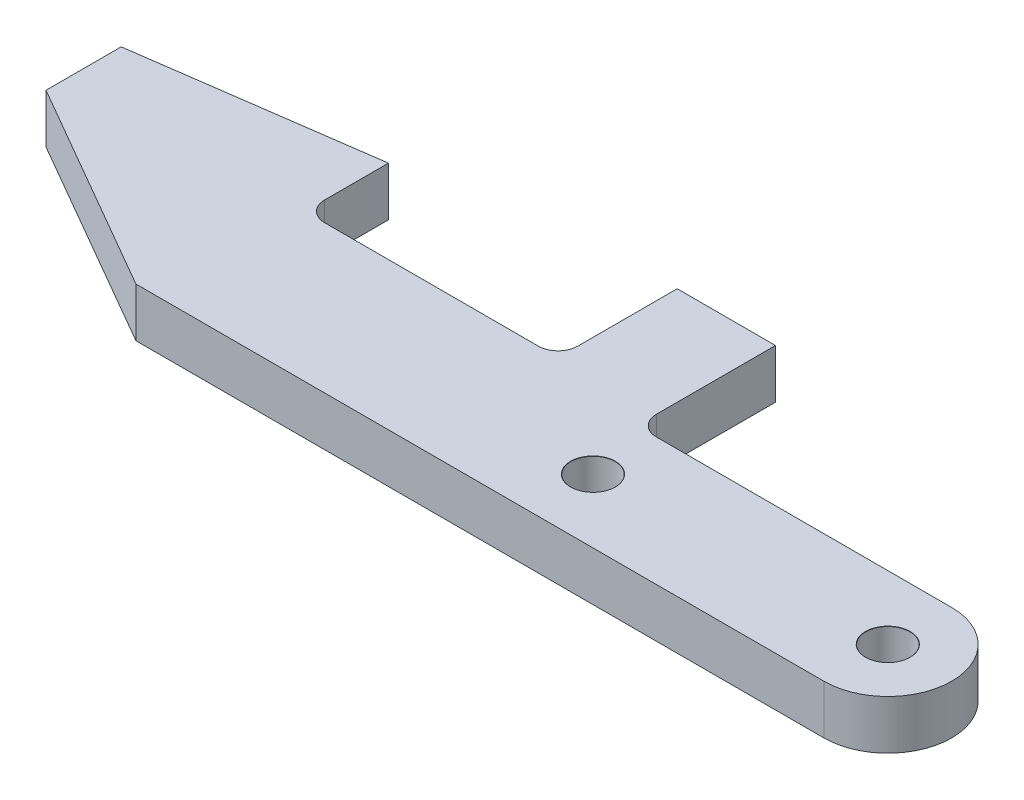
ISO-10303-21;
HEADER;
FILE_DESCRIPTION(('STEP AP214'),'2;1');
FILE_NAME('part.step','',(''),(''),'','','');
FILE_SCHEMA(('AUTOMOTIVE_DESIGN { 1 0 10303 214 1 1 1 1 }'));
ENDSEC;
DATA;
#1=APPLICATION_CONTEXT('core data for automotive mechanical design processes');
#2=APPLICATION_PROTOCOL_DEFINITION('international standard','automotive_design',2000,#1);
#3=PRODUCT_CONTEXT('',#1,'mechanical');
#4=PRODUCT('Part','Part','',(#3));
#5=PRODUCT_RELATED_PRODUCT_CATEGORY('part','',(#4));
#6=PRODUCT_DEFINITION_FORMATION('','',#4);
#7=PRODUCT_DEFINITION_CONTEXT('part definition',#1,'design');
#8=PRODUCT_DEFINITION('design','',#6,#7);
#9=PRODUCT_DEFINITION_SHAPE('','',#8);
#10=(LENGTH_UNIT() NAMED_UNIT(*) SI_UNIT(.MILLI.,.METRE.));
#11=(NAMED_UNIT(*) PLANE_ANGLE_UNIT() SI_UNIT($,.RADIAN.));
#12=(NAMED_UNIT(*) SI_UNIT($,.STERADIAN.) SOLID_ANGLE_UNIT());
#13=UNCERTAINTY_MEASURE_WITH_UNIT(LENGTH_MEASURE(1.E-05),#10,'distance_accuracy_value','');
#14=(GEOMETRIC_REPRESENTATION_CONTEXT(3) GLOBAL_UNCERTAINTY_ASSIGNED_CONTEXT((#13)) GLOBAL_UNIT_ASSIGNED_CONTEXT((#10,
#11,#12)) REPRESENTATION_CONTEXT('',''));
#15=CARTESIAN_POINT('',(0.,0.,0.));
#16=DIRECTION('',(0.,0.,1.));
#17=DIRECTION('',(1.,0.,0.));
#18=AXIS2_PLACEMENT_3D('',#15,#16,#17);
#19=CARTESIAN_POINT('',(-56.6506350946111,5.,-20.1491745987615));
#20=DIRECTION('',(0.139173100960062,0.,0.990268068741571));
#21=DIRECTION('',(0.990268068741571,0.,-0.139173100960062));
#22=AXIS2_PLACEMENT_3D('',#19,#20,#21);
#23=PLANE('',#22);
#24=DIRECTION('',(-0.990268068741571,0.,0.139173100960062));
#25=VECTOR('',#24,1.);
#26=CARTESIAN_POINT('',(-56.6506350946111,5.,-20.1491745987615));
#27=LINE('',#26,#25);
#28=CARTESIAN_POINT('',(-32.8082734896425,5.,-23.5));
#29=VERTEX_POINT('',#28);
#30=CARTESIAN_POINT('',(-56.6506350946111,5.,-20.1491745987615));
#31=VERTEX_POINT('',#30);
#32=EDGE_CURVE('E176',#29,#31,#27,.T.);
#33=ORIENTED_EDGE('',*,*,#32,.F.);
#34=DIRECTION('',(0.,1.,0.));
#35=VECTOR('',#34,1.);
#36=CARTESIAN_POINT('',(-32.8082734896425,0.,-23.5));
#37=LINE('',#36,#35);
#38=CARTESIAN_POINT('',(-32.8082734896425,0.,-23.5));
#39=VERTEX_POINT('',#38);
#40=EDGE_CURVE('E338',#39,#29,#37,.T.);
#41=ORIENTED_EDGE('',*,*,#40,.F.);
#42=DIRECTION('',(-0.990268068741571,0.,0.139173100960062));
#43=VECTOR('',#42,1.);
#44=CARTESIAN_POINT('',(-56.6506350946111,0.,-20.1491745987615));
#45=LINE('',#44,#43);
#46=CARTESIAN_POINT('',(-56.6506350946111,0.,-20.1491745987615));
#47=VERTEX_POINT('',#46);
#48=EDGE_CURVE('E291',#39,#47,#45,.T.);
#49=ORIENTED_EDGE('',*,*,#48,.T.);
#50=DIRECTION('',(0.,-1.,0.));
#51=VECTOR('',#50,1.);
#52=CARTESIAN_POINT('',(-56.6506350946111,5.,-20.1491745987615));
#53=LINE('',#52,#51);
#54=EDGE_CURVE('E206',#31,#47,#53,.T.);
#55=ORIENTED_EDGE('',*,*,#54,.F.);
#56=EDGE_LOOP('',(#33,#41,#49,#55));
#57=FACE_BOUND('',#56,.T.);
#58=ADVANCED_FACE('F43',(#57),#23,.F.);
#59=CARTESIAN_POINT('',(-56.6506350946111,5.,-12.4999999999999));
#60=DIRECTION('',(1.,0.,0.));
#61=DIRECTION('',(0.,0.,-1.));
#62=AXIS2_PLACEMENT_3D('',#59,#60,#61);
#63=PLANE('',#62);
#64=DIRECTION('',(0.,0.,1.));
#65=VECTOR('',#64,1.);
#66=CARTESIAN_POINT('',(-56.6506350946111,0.,-12.4999999999999));
#67=LINE('',#66,#65);
#68=CARTESIAN_POINT('',(-56.6506350946111,0.,-12.4999999999999));
#69=VERTEX_POINT('',#68);
#70=EDGE_CURVE('E294',#47,#69,#67,.T.);
#71=ORIENTED_EDGE('',*,*,#70,.T.);
#72=DIRECTION('',(0.,-1.,0.));
#73=VECTOR('',#72,1.);
#74=CARTESIAN_POINT('',(-56.6506350946111,5.,-12.4999999999999));
#75=LINE('',#74,#73);
#76=CARTESIAN_POINT('',(-56.6506350946111,5.,-12.4999999999999));
#77=VERTEX_POINT('',#76);
#78=EDGE_CURVE('E202',#77,#69,#75,.T.);
#79=ORIENTED_EDGE('',*,*,#78,.F.);
#80=DIRECTION('',(0.,0.,1.));
#81=VECTOR('',#80,1.);
#82=CARTESIAN_POINT('',(-56.6506350946111,5.,-12.4999999999999));
#83=LINE('',#82,#81);
#84=EDGE_CURVE('E182',#31,#77,#83,.T.);
#85=ORIENTED_EDGE('',*,*,#84,.F.);
#86=ORIENTED_EDGE('',*,*,#54,.T.);
#87=EDGE_LOOP('',(#71,#79,#85,#86));
#88=FACE_BOUND('',#87,.T.);
#89=ADVANCED_FACE('F390',(#88),#63,.F.);
#90=CARTESIAN_POINT('',(-35.,5.,0.));
#91=DIRECTION('',(0.499999999999994,0.,-0.866025403784442));
#92=DIRECTION('',(-0.866025403784442,0.,-0.499999999999994));
#93=AXIS2_PLACEMENT_3D('',#90,#91,#92);
#94=PLANE('',#93);
#95=DIRECTION('',(0.866025403784442,0.,0.499999999999994));
#96=VECTOR('',#95,1.);
#97=CARTESIAN_POINT('',(-35.,0.,0.));
#98=LINE('',#97,#96);
#99=CARTESIAN_POINT('',(-35.,0.,0.));
#100=VERTEX_POINT('',#99);
#101=EDGE_CURVE('E298',#69,#100,#98,.T.);
#102=ORIENTED_EDGE('',*,*,#101,.T.);
#103=DIRECTION('',(0.,-1.,0.));
#104=VECTOR('',#103,1.);
#105=CARTESIAN_POINT('',(-35.,5.,0.));
#106=LINE('',#105,#104);
#107=CARTESIAN_POINT('',(-35.,5.,0.));
#108=VERTEX_POINT('',#107);
#109=EDGE_CURVE('E198',#108,#100,#106,.T.);
#110=ORIENTED_EDGE('',*,*,#109,.F.);
#111=DIRECTION('',(0.866025403784442,0.,0.499999999999994));
#112=VECTOR('',#111,1.);
#113=CARTESIAN_POINT('',(-35.,5.,0.));
#114=LINE('',#113,#112);
#115=EDGE_CURVE('E279',#77,#108,#114,.T.);
#116=ORIENTED_EDGE('',*,*,#115,.F.);
#117=ORIENTED_EDGE('',*,*,#78,.T.);
#118=EDGE_LOOP('',(#102,#110,#116,#117));
#119=FACE_BOUND('',#118,.T.);
#120=ADVANCED_FACE('F397',(#119),#94,.F.);
#121=CARTESIAN_POINT('',(-35.,5.,0.));
#122=DIRECTION('',(0.,0.,-1.));
#123=DIRECTION('',(-1.,0.,0.));
#124=AXIS2_PLACEMENT_3D('',#121,#122,#123);
#125=PLANE('',#124);
#126=DIRECTION('',(1.,0.,0.));
#127=VECTOR('',#126,1.);
#128=CARTESIAN_POINT('',(-35.,0.,0.));
#129=LINE('',#128,#127);
#130=CARTESIAN_POINT('',(35.,0.,0.));
#131=VERTEX_POINT('',#130);
#132=EDGE_CURVE('E301',#100,#131,#129,.T.);
#133=ORIENTED_EDGE('',*,*,#132,.T.);
#134=DIRECTION('',(0.,-1.,0.));
#135=VECTOR('',#134,1.);
#136=CARTESIAN_POINT('',(35.,5.,0.));
#137=LINE('',#136,#135);
#138=CARTESIAN_POINT('',(35.,5.,0.));
#139=VERTEX_POINT('',#138);
#140=EDGE_CURVE('E194',#139,#131,#137,.T.);
#141=ORIENTED_EDGE('',*,*,#140,.F.);
#142=DIRECTION('',(1.,0.,0.));
#143=VECTOR('',#142,1.);
#144=CARTESIAN_POINT('',(-35.,5.,0.));
#145=LINE('',#144,#143);
#146=EDGE_CURVE('E275',#108,#139,#145,.T.);
#147=ORIENTED_EDGE('',*,*,#146,.F.);
#148=ORIENTED_EDGE('',*,*,#109,.T.);
#149=EDGE_LOOP('',(#133,#141,#147,#148));
#150=FACE_BOUND('',#149,.T.);
#151=ADVANCED_FACE('F434',(#150),#125,.F.);
#152=CARTESIAN_POINT('',(35.,5.,-6.49999999999995));
#153=DIRECTION('',(0.,-1.,0.));
#154=DIRECTION('',(0.,0.,-1.));
#155=AXIS2_PLACEMENT_3D('',#152,#153,#154);
#156=CYLINDRICAL_SURFACE('',#155,6.49999999999995);
#157=CARTESIAN_POINT('',(35.,0.,-6.49999999999995));
#158=DIRECTION('',(0.,1.,0.));
#159=DIRECTION('',(0.,0.,1.));
#160=AXIS2_PLACEMENT_3D('',#157,#158,#159);
#161=CIRCLE('',#160,6.49999999999995);
#162=CARTESIAN_POINT('',(35.,0.,-12.9999999999999));
#163=VERTEX_POINT('',#162);
#164=EDGE_CURVE('E304',#131,#163,#161,.T.);
#165=ORIENTED_EDGE('',*,*,#164,.T.);
#166=DIRECTION('',(0.,-1.,0.));
#167=VECTOR('',#166,1.);
#168=CARTESIAN_POINT('',(35.,5.,-12.9999999999999));
#169=LINE('',#168,#167);
#170=CARTESIAN_POINT('',(35.,5.,-12.9999999999999));
#171=VERTEX_POINT('',#170);
#172=EDGE_CURVE('E190',#171,#163,#169,.T.);
#173=ORIENTED_EDGE('',*,*,#172,.F.);
#174=CARTESIAN_POINT('',(35.,5.,-6.49999999999995));
#175=DIRECTION('',(0.,1.,0.));
#176=DIRECTION('',(0.,0.,1.));
#177=AXIS2_PLACEMENT_3D('',#174,#175,#176);
#178=CIRCLE('',#177,6.49999999999995);
#179=EDGE_CURVE('E271',#139,#171,#178,.T.);
#180=ORIENTED_EDGE('',*,*,#179,.F.);
#181=ORIENTED_EDGE('',*,*,#140,.T.);
#182=EDGE_LOOP('',(#165,#173,#180,#181));
#183=FACE_BOUND('',#182,.T.);
#184=ADVANCED_FACE('F437',(#183),#156,.T.);
#185=CARTESIAN_POINT('',(35.,5.,-12.9999999999999));
#186=DIRECTION('',(0.,0.,1.));
#187=DIRECTION('',(1.,0.,0.));
#188=AXIS2_PLACEMENT_3D('',#185,#186,#187);
#189=PLANE('',#188);
#190=DIRECTION('',(-1.,0.,0.));
#191=VECTOR('',#190,1.);
#192=CARTESIAN_POINT('',(35.,0.,-12.9999999999999));
#193=LINE('',#192,#191);
#194=CARTESIAN_POINT('',(4.94936490538895,0.,-13.));
#195=VERTEX_POINT('',#194);
#196=EDGE_CURVE('E184',#163,#195,#193,.T.);
#197=ORIENTED_EDGE('',*,*,#196,.T.);
#198=DIRECTION('',(0.,-1.,0.));
#199=VECTOR('',#198,1.);
#200=CARTESIAN_POINT('',(4.94936490538895,5.,-13.));
#201=LINE('',#200,#199);
#202=CARTESIAN_POINT('',(4.94936490538895,5.,-13.));
#203=VERTEX_POINT('',#202);
#204=EDGE_CURVE('E214',#195,#203,#201,.F.);
#205=ORIENTED_EDGE('',*,*,#204,.T.);
#206=DIRECTION('',(-1.,0.,0.));
#207=VECTOR('',#206,1.);
#208=CARTESIAN_POINT('',(35.,5.,-12.9999999999999));
#209=LINE('',#208,#207);
#210=EDGE_CURVE('E266',#171,#203,#209,.T.);
#211=ORIENTED_EDGE('',*,*,#210,.F.);
#212=ORIENTED_EDGE('',*,*,#172,.T.);
#213=EDGE_LOOP('',(#197,#205,#211,#212));
#214=FACE_BOUND('',#213,.T.);
#215=ADVANCED_FACE('F312',(#214),#189,.F.);
#216=CARTESIAN_POINT('',(2.94936490538897,5.,-27.12));
#217=DIRECTION('',(-1.,0.,0.));
#218=DIRECTION('',(0.,0.,1.));
#219=AXIS2_PLACEMENT_3D('',#216,#217,#218);
#220=PLANE('',#219);
#221=DIRECTION('',(0.,0.,-1.));
#222=VECTOR('',#221,1.);
#223=CARTESIAN_POINT('',(2.94936490538897,5.,-27.12));
#224=LINE('',#223,#222);
#225=CARTESIAN_POINT('',(2.94936490538895,5.,-15.));
#226=VERTEX_POINT('',#225);
#227=CARTESIAN_POINT('',(2.94936490538897,5.,-27.12));
#228=VERTEX_POINT('',#227);
#229=EDGE_CURVE('E262',#226,#228,#224,.T.);
#230=ORIENTED_EDGE('',*,*,#229,.F.);
#231=DIRECTION('',(0.,-1.,0.));
#232=VECTOR('',#231,1.);
#233=CARTESIAN_POINT('',(2.94936490538895,0.,-15.));
#234=LINE('',#233,#232);
#235=CARTESIAN_POINT('',(2.94936490538895,0.,-15.));
#236=VERTEX_POINT('',#235);
#237=EDGE_CURVE('E210',#226,#236,#234,.T.);
#238=ORIENTED_EDGE('',*,*,#237,.T.);
#239=DIRECTION('',(0.,0.,-1.));
#240=VECTOR('',#239,1.);
#241=CARTESIAN_POINT('',(2.94936490538897,0.,-27.12));
#242=LINE('',#241,#240);
#243=CARTESIAN_POINT('',(2.94936490538897,0.,-27.12));
#244=VERTEX_POINT('',#243);
#245=EDGE_CURVE('E177',#236,#244,#242,.T.);
#246=ORIENTED_EDGE('',*,*,#245,.T.);
#247=DIRECTION('',(0.,-1.,0.));
#248=VECTOR('',#247,1.);
#249=CARTESIAN_POINT('',(2.94936490538897,5.,-27.12));
#250=LINE('',#249,#248);
#251=EDGE_CURVE('E169',#228,#244,#250,.T.);
#252=ORIENTED_EDGE('',*,*,#251,.F.);
#253=EDGE_LOOP('',(#230,#238,#246,#252));
#254=FACE_BOUND('',#253,.T.);
#255=ADVANCED_FACE('F324',(#254),#220,.F.);
#256=CARTESIAN_POINT('',(-7.05063509461103,5.,-27.12));
#257=DIRECTION('',(0.,0.,1.));
#258=DIRECTION('',(1.,0.,0.));
#259=AXIS2_PLACEMENT_3D('',#256,#257,#258);
#260=PLANE('',#259);
#261=DIRECTION('',(-1.,0.,0.));
#262=VECTOR('',#261,1.);
#263=CARTESIAN_POINT('',(-7.05063509461103,0.,-27.12));
#264=LINE('',#263,#262);
#265=CARTESIAN_POINT('',(-7.05063509461103,0.,-27.12));
#266=VERTEX_POINT('',#265);
#267=EDGE_CURVE('E149',#244,#266,#264,.T.);
#268=ORIENTED_EDGE('',*,*,#267,.T.);
#269=DIRECTION('',(0.,-1.,0.));
#270=VECTOR('',#269,1.);
#271=CARTESIAN_POINT('',(-7.05063509461103,5.,-27.12));
#272=LINE('',#271,#270);
#273=CARTESIAN_POINT('',(-7.05063509461103,5.,-27.12));
#274=VERTEX_POINT('',#273);
#275=EDGE_CURVE('E161',#274,#266,#272,.T.);
#276=ORIENTED_EDGE('',*,*,#275,.F.);
#277=DIRECTION('',(-1.,0.,0.));
#278=VECTOR('',#277,1.);
#279=CARTESIAN_POINT('',(-7.05063509461103,5.,-27.12));
#280=LINE('',#279,#278);
#281=EDGE_CURVE('E170',#228,#274,#280,.T.);
#282=ORIENTED_EDGE('',*,*,#281,.F.);
#283=ORIENTED_EDGE('',*,*,#251,.T.);
#284=EDGE_LOOP('',(#268,#276,#282,#283));
#285=FACE_BOUND('',#284,.T.);
#286=ADVANCED_FACE('F173',(#285),#260,.F.);
#287=CARTESIAN_POINT('',(35.,5.,-6.49999999999995));
#288=DIRECTION('',(0.,1.,0.));
#289=DIRECTION('',(0.,0.,1.));
#290=AXIS2_PLACEMENT_3D('',#287,#288,#289);
#291=PLANE('',#290);
#292=DIRECTION('',(0.,0.,-1.));
#293=VECTOR('',#292,1.);
#294=CARTESIAN_POINT('',(-7.05063509461103,5.,-27.12));
#295=LINE('',#294,#293);
#296=CARTESIAN_POINT('',(-7.05063509461103,5.,-17.));
#297=VERTEX_POINT('',#296);
#298=EDGE_CURVE('E164',#297,#274,#295,.T.);
#299=ORIENTED_EDGE('',*,*,#298,.F.);
#300=CARTESIAN_POINT('',(-9.05063509461103,5.,-17.));
#301=DIRECTION('',(0.,1.,0.));
#302=DIRECTION('',(0.,0.,1.));
#303=AXIS2_PLACEMENT_3D('',#300,#301,#302);
#304=CIRCLE('',#303,2.);
#305=CARTESIAN_POINT('',(-9.05063509461103,5.,-15.));
#306=VERTEX_POINT('',#305);
#307=EDGE_CURVE('E235',#297,#306,#304,.F.);
#308=ORIENTED_EDGE('',*,*,#307,.T.);
#309=DIRECTION('',(1.,0.,0.));
#310=VECTOR('',#309,1.);
#311=CARTESIAN_POINT('',(-7.05063509461103,5.,-15.));
#312=LINE('',#311,#310);
#313=CARTESIAN_POINT('',(-30.8082734896425,5.,-15.));
#314=VERTEX_POINT('',#313);
#315=EDGE_CURVE('E158',#314,#306,#312,.T.);
#316=ORIENTED_EDGE('',*,*,#315,.F.);
#317=CARTESIAN_POINT('',(-30.8082734896425,5.,-17.));
#318=DIRECTION('',(0.,1.,0.));
#319=DIRECTION('',(0.,0.,1.));
#320=AXIS2_PLACEMENT_3D('',#317,#318,#319);
#321=CIRCLE('',#320,2.);
#322=CARTESIAN_POINT('',(-32.8082734896425,5.,-17.));
#323=VERTEX_POINT('',#322);
#324=EDGE_CURVE('E52',#314,#323,#321,.F.);
#325=ORIENTED_EDGE('',*,*,#324,.T.);
#326=DIRECTION('',(0.,0.,1.));
#327=VECTOR('',#326,1.);
#328=CARTESIAN_POINT('',(-32.8082734896425,5.,-23.5));
#329=LINE('',#328,#327);
#330=EDGE_CURVE('E327',#29,#323,#329,.T.);
#331=ORIENTED_EDGE('',*,*,#330,.F.);
#332=ORIENTED_EDGE('',*,*,#32,.T.);
#333=ORIENTED_EDGE('',*,*,#84,.T.);
#334=ORIENTED_EDGE('',*,*,#115,.T.);
#335=ORIENTED_EDGE('',*,*,#146,.T.);
#336=ORIENTED_EDGE('',*,*,#179,.T.);
#337=ORIENTED_EDGE('',*,*,#210,.T.);
#338=CARTESIAN_POINT('',(4.94936490538895,5.,-15.));
#339=DIRECTION('',(0.,1.,0.));
#340=DIRECTION('',(0.,0.,1.));
#341=AXIS2_PLACEMENT_3D('',#338,#339,#340);
#342=CIRCLE('',#341,2.);
#343=EDGE_CURVE('E232',#203,#226,#342,.F.);
#344=ORIENTED_EDGE('',*,*,#343,.T.);
#345=ORIENTED_EDGE('',*,*,#229,.T.);
#346=ORIENTED_EDGE('',*,*,#281,.T.);
#347=EDGE_LOOP('',(#299,#308,#316,#325,#331,#332,#333,#334,#335,#336,#337,#344,#345,#346));
#348=FACE_BOUND('',#347,.T.);
#349=CARTESIAN_POINT('',(35.,5.,-6.49999999999995));
#350=DIRECTION('',(0.,1.,0.));
#351=DIRECTION('',(0.,0.,1.));
#352=AXIS2_PLACEMENT_3D('',#349,#350,#351);
#353=CIRCLE('',#352,2.275);
#354=CARTESIAN_POINT('',(35.,5.,-4.22499999999995));
#355=VERTEX_POINT('',#354);
#356=EDGE_CURVE('E341',#355,#355,#353,.T.);
#357=ORIENTED_EDGE('',*,*,#356,.F.);
#358=EDGE_LOOP('',(#357));
#359=FACE_BOUND('',#358,.T.);
#360=CARTESIAN_POINT('',(5.,5.,-6.49999999999995));
#361=DIRECTION('',(0.,1.,0.));
#362=DIRECTION('',(0.,0.,1.));
#363=AXIS2_PLACEMENT_3D('',#360,#361,#362);
#364=CIRCLE('',#363,2.275);
#365=CARTESIAN_POINT('',(5.,5.,-4.22499999999995));
#366=VERTEX_POINT('',#365);
#367=EDGE_CURVE('E353',#366,#366,#364,.T.);
#368=ORIENTED_EDGE('',*,*,#367,.F.);
#369=EDGE_LOOP('',(#368));
#370=FACE_BOUND('',#369,.T.);
#371=ADVANCED_FACE('F321',(#348,#359,#370),#291,.T.);
#372=CARTESIAN_POINT('',(35.,0.,-6.49999999999995));
#373=DIRECTION('',(0.,1.,0.));
#374=DIRECTION('',(0.,0.,1.));
#375=AXIS2_PLACEMENT_3D('',#372,#373,#374);
#376=PLANE('',#375);
#377=CARTESIAN_POINT('',(35.,0.,-6.49999999999995));
#378=DIRECTION('',(0.,1.,0.));
#379=DIRECTION('',(0.,0.,1.));
#380=AXIS2_PLACEMENT_3D('',#377,#378,#379);
#381=CIRCLE('',#380,2.25);
#382=CARTESIAN_POINT('',(35.,0.,-4.24999999999995));
#383=VERTEX_POINT('',#382);
#384=EDGE_CURVE('E349',#383,#383,#381,.T.);
#385=ORIENTED_EDGE('',*,*,#384,.T.);
#386=EDGE_LOOP('',(#385));
#387=FACE_BOUND('',#386,.T.);
#388=CARTESIAN_POINT('',(5.,0.,-6.49999999999995));
#389=DIRECTION('',(0.,1.,0.));
#390=DIRECTION('',(0.,0.,1.));
#391=AXIS2_PLACEMENT_3D('',#388,#389,#390);
#392=CIRCLE('',#391,2.25);
#393=CARTESIAN_POINT('',(5.,0.,-4.24999999999995));
#394=VERTEX_POINT('',#393);
#395=EDGE_CURVE('E295',#394,#394,#392,.T.);
#396=ORIENTED_EDGE('',*,*,#395,.T.);
#397=EDGE_LOOP('',(#396));
#398=FACE_BOUND('',#397,.T.);
#399=DIRECTION('',(0.,0.,1.));
#400=VECTOR('',#399,1.);
#401=CARTESIAN_POINT('',(-32.8082734896425,0.,-23.5));
#402=LINE('',#401,#400);
#403=CARTESIAN_POINT('',(-32.8082734896425,0.,-17.));
#404=VERTEX_POINT('',#403);
#405=EDGE_CURVE('E157',#39,#404,#402,.T.);
#406=ORIENTED_EDGE('',*,*,#405,.T.);
#407=CARTESIAN_POINT('',(-30.8082734896425,0.,-17.));
#408=DIRECTION('',(0.,1.,0.));
#409=DIRECTION('',(0.,0.,1.));
#410=AXIS2_PLACEMENT_3D('',#407,#408,#409);
#411=CIRCLE('',#410,2.);
#412=CARTESIAN_POINT('',(-30.8082734896425,0.,-15.));
#413=VERTEX_POINT('',#412);
#414=EDGE_CURVE('E11',#404,#413,#411,.T.);
#415=ORIENTED_EDGE('',*,*,#414,.T.);
#416=DIRECTION('',(1.,0.,0.));
#417=VECTOR('',#416,1.);
#418=CARTESIAN_POINT('',(-7.05063509461103,0.,-15.));
#419=LINE('',#418,#417);
#420=CARTESIAN_POINT('',(-9.05063509461103,0.,-15.));
#421=VERTEX_POINT('',#420);
#422=EDGE_CURVE('E333',#413,#421,#419,.T.);
#423=ORIENTED_EDGE('',*,*,#422,.T.);
#424=CARTESIAN_POINT('',(-9.05063509461103,0.,-17.));
#425=DIRECTION('',(0.,1.,0.));
#426=DIRECTION('',(0.,0.,1.));
#427=AXIS2_PLACEMENT_3D('',#424,#425,#426);
#428=CIRCLE('',#427,2.);
#429=CARTESIAN_POINT('',(-7.05063509461103,0.,-17.));
#430=VERTEX_POINT('',#429);
#431=EDGE_CURVE('E152',#421,#430,#428,.T.);
#432=ORIENTED_EDGE('',*,*,#431,.T.);
#433=DIRECTION('',(0.,0.,-1.));
#434=VECTOR('',#433,1.);
#435=CARTESIAN_POINT('',(-7.05063509461103,0.,-27.12));
#436=LINE('',#435,#434);
#437=EDGE_CURVE('E144',#430,#266,#436,.T.);
#438=ORIENTED_EDGE('',*,*,#437,.T.);
#439=ORIENTED_EDGE('',*,*,#267,.F.);
#440=ORIENTED_EDGE('',*,*,#245,.F.);
#441=CARTESIAN_POINT('',(4.94936490538895,0.,-15.));
#442=DIRECTION('',(0.,1.,0.));
#443=DIRECTION('',(0.,0.,1.));
#444=AXIS2_PLACEMENT_3D('',#441,#442,#443);
#445=CIRCLE('',#444,2.);
#446=EDGE_CURVE('E229',#236,#195,#445,.T.);
#447=ORIENTED_EDGE('',*,*,#446,.T.);
#448=ORIENTED_EDGE('',*,*,#196,.F.);
#449=ORIENTED_EDGE('',*,*,#164,.F.);
#450=ORIENTED_EDGE('',*,*,#132,.F.);
#451=ORIENTED_EDGE('',*,*,#101,.F.);
#452=ORIENTED_EDGE('',*,*,#70,.F.);
#453=ORIENTED_EDGE('',*,*,#48,.F.);
#454=EDGE_LOOP('',(#406,#415,#423,#432,#438,#439,#440,#447,#448,#449,#450,#451,#452,#453));
#455=FACE_BOUND('',#454,.T.);
#456=ADVANCED_FACE('F146',(#387,#398,#455),#376,.F.);
#457=CARTESIAN_POINT('',(5.,5.,-6.49999999999995));
#458=DIRECTION('',(0.,1.,0.));
#459=DIRECTION('',(0.,0.,1.));
#460=AXIS2_PLACEMENT_3D('',#457,#458,#459);
#461=CYLINDRICAL_SURFACE('',#460,2.25);
#462=ORIENTED_EDGE('',*,*,#395,.F.);
#463=EDGE_LOOP('',(#462));
#464=FACE_BOUND('',#463,.T.);
#465=CARTESIAN_POINT('',(5.,4.97902250922057,-6.49999999999995));
#466=DIRECTION('',(0.,1.,0.));
#467=DIRECTION('',(0.,0.,1.));
#468=AXIS2_PLACEMENT_3D('',#465,#466,#467);
#469=CIRCLE('',#468,2.25);
#470=CARTESIAN_POINT('',(5.,4.97902250922057,-4.24999999999995));
#471=VERTEX_POINT('',#470);
#472=EDGE_CURVE('E357',#471,#471,#469,.T.);
#473=ORIENTED_EDGE('',*,*,#472,.T.);
#474=EDGE_LOOP('',(#473));
#475=FACE_BOUND('',#474,.T.);
#476=ADVANCED_FACE('F366',(#464,#475),#461,.F.);
#477=CARTESIAN_POINT('',(5.,5.,-6.49999999999995));
#478=DIRECTION('',(0.,1.,0.));
#479=DIRECTION('',(0.,0.,1.));
#480=AXIS2_PLACEMENT_3D('',#477,#478,#479);
#481=CONICAL_SURFACE('',#480,2.275,0.872664625997182);
#482=ORIENTED_EDGE('',*,*,#472,.F.);
#483=EDGE_LOOP('',(#482));
#484=FACE_BOUND('',#483,.T.);
#485=ORIENTED_EDGE('',*,*,#367,.T.);
#486=EDGE_LOOP('',(#485));
#487=FACE_BOUND('',#486,.T.);
#488=ADVANCED_FACE('F369',(#484,#487),#481,.F.);
#489=CARTESIAN_POINT('',(35.,5.,-6.49999999999995));
#490=DIRECTION('',(0.,1.,0.));
#491=DIRECTION('',(0.,0.,1.));
#492=AXIS2_PLACEMENT_3D('',#489,#490,#491);
#493=CYLINDRICAL_SURFACE('',#492,2.25);
#494=ORIENTED_EDGE('',*,*,#384,.F.);
#495=EDGE_LOOP('',(#494));
#496=FACE_BOUND('',#495,.T.);
#497=CARTESIAN_POINT('',(35.,4.97902250922057,-6.49999999999995));
#498=DIRECTION('',(0.,1.,0.));
#499=DIRECTION('',(0.,0.,1.));
#500=AXIS2_PLACEMENT_3D('',#497,#498,#499);
#501=CIRCLE('',#500,2.25);
#502=CARTESIAN_POINT('',(35.,4.97902250922057,-4.24999999999995));
#503=VERTEX_POINT('',#502);
#504=EDGE_CURVE('E345',#503,#503,#501,.T.);
#505=ORIENTED_EDGE('',*,*,#504,.T.);
#506=EDGE_LOOP('',(#505));
#507=FACE_BOUND('',#506,.T.);
#508=ADVANCED_FACE('F375',(#496,#507),#493,.F.);
#509=CARTESIAN_POINT('',(35.,5.,-6.49999999999995));
#510=DIRECTION('',(0.,1.,0.));
#511=DIRECTION('',(0.,0.,1.));
#512=AXIS2_PLACEMENT_3D('',#509,#510,#511);
#513=CONICAL_SURFACE('',#512,2.275,0.872664625997131);
#514=ORIENTED_EDGE('',*,*,#504,.F.);
#515=EDGE_LOOP('',(#514));
#516=FACE_BOUND('',#515,.T.);
#517=ORIENTED_EDGE('',*,*,#356,.T.);
#518=EDGE_LOOP('',(#517));
#519=FACE_BOUND('',#518,.T.);
#520=ADVANCED_FACE('F512',(#516,#519),#513,.F.);
#521=CARTESIAN_POINT('',(-7.05063509461103,0.,-27.12));
#522=DIRECTION('',(1.,0.,0.));
#523=DIRECTION('',(0.,0.,-1.));
#524=AXIS2_PLACEMENT_3D('',#521,#522,#523);
#525=PLANE('',#524);
#526=ORIENTED_EDGE('',*,*,#437,.F.);
#527=DIRECTION('',(0.,1.,0.));
#528=VECTOR('',#527,1.);
#529=CARTESIAN_POINT('',(-7.05063509461103,5.,-17.));
#530=LINE('',#529,#528);
#531=EDGE_CURVE('E217',#430,#297,#530,.T.);
#532=ORIENTED_EDGE('',*,*,#531,.T.);
#533=ORIENTED_EDGE('',*,*,#298,.T.);
#534=ORIENTED_EDGE('',*,*,#275,.T.);
#535=EDGE_LOOP('',(#526,#532,#533,#534));
#536=FACE_BOUND('',#535,.T.);
#537=ADVANCED_FACE('F162',(#536),#525,.F.);
#538=CARTESIAN_POINT('',(-7.05063509461103,0.,-15.));
#539=DIRECTION('',(0.,0.,1.));
#540=DIRECTION('',(1.,0.,0.));
#541=AXIS2_PLACEMENT_3D('',#538,#539,#540);
#542=PLANE('',#541);
#543=ORIENTED_EDGE('',*,*,#315,.T.);
#544=DIRECTION('',(0.,1.,0.));
#545=VECTOR('',#544,1.);
#546=CARTESIAN_POINT('',(-9.05063509461103,0.,-15.));
#547=LINE('',#546,#545);
#548=EDGE_CURVE('E224',#306,#421,#547,.F.);
#549=ORIENTED_EDGE('',*,*,#548,.T.);
#550=ORIENTED_EDGE('',*,*,#422,.F.);
#551=DIRECTION('',(0.,1.,0.));
#552=VECTOR('',#551,1.);
#553=CARTESIAN_POINT('',(-30.8082734896425,5.,-15.));
#554=LINE('',#553,#552);
#555=EDGE_CURVE('E220',#413,#314,#554,.T.);
#556=ORIENTED_EDGE('',*,*,#555,.T.);
#557=EDGE_LOOP('',(#543,#549,#550,#556));
#558=FACE_BOUND('',#557,.T.);
#559=ADVANCED_FACE('F415',(#558),#542,.F.);
#560=CARTESIAN_POINT('',(-32.8082734896425,0.,-23.5));
#561=DIRECTION('',(-1.,0.,0.));
#562=DIRECTION('',(0.,0.,1.));
#563=AXIS2_PLACEMENT_3D('',#560,#561,#562);
#564=PLANE('',#563);
#565=ORIENTED_EDGE('',*,*,#330,.T.);
#566=DIRECTION('',(0.,1.,0.));
#567=VECTOR('',#566,1.);
#568=CARTESIAN_POINT('',(-32.8082734896425,0.,-17.));
#569=LINE('',#568,#567);
#570=EDGE_CURVE('E59',#323,#404,#569,.F.);
#571=ORIENTED_EDGE('',*,*,#570,.T.);
#572=ORIENTED_EDGE('',*,*,#405,.F.);
#573=ORIENTED_EDGE('',*,*,#40,.T.);
#574=EDGE_LOOP('',(#565,#571,#572,#573));
#575=FACE_BOUND('',#574,.T.);
#576=ADVANCED_FACE('F405',(#575),#564,.F.);
#577=CARTESIAN_POINT('',(4.94936490538895,5.,-15.));
#578=DIRECTION('',(0.,1.,0.));
#579=DIRECTION('',(0.,0.,1.));
#580=AXIS2_PLACEMENT_3D('',#577,#578,#579);
#581=CYLINDRICAL_SURFACE('',#580,2.);
#582=ORIENTED_EDGE('',*,*,#343,.F.);
#583=ORIENTED_EDGE('',*,*,#204,.F.);
#584=ORIENTED_EDGE('',*,*,#446,.F.);
#585=ORIENTED_EDGE('',*,*,#237,.F.);
#586=EDGE_LOOP('',(#582,#583,#584,#585));
#587=FACE_BOUND('',#586,.T.);
#588=ADVANCED_FACE('F318',(#587),#581,.F.);
#589=CARTESIAN_POINT('',(-9.05063509461103,0.,-17.));
#590=DIRECTION('',(0.,-1.,0.));
#591=DIRECTION('',(0.,0.,-1.));
#592=AXIS2_PLACEMENT_3D('',#589,#590,#591);
#593=CYLINDRICAL_SURFACE('',#592,2.);
#594=ORIENTED_EDGE('',*,*,#431,.F.);
#595=ORIENTED_EDGE('',*,*,#548,.F.);
#596=ORIENTED_EDGE('',*,*,#307,.F.);
#597=ORIENTED_EDGE('',*,*,#531,.F.);
#598=EDGE_LOOP('',(#594,#595,#596,#597));
#599=FACE_BOUND('',#598,.T.);
#600=ADVANCED_FACE('F404',(#599),#593,.F.);
#601=CARTESIAN_POINT('',(-30.8082734896425,0.,-17.));
#602=DIRECTION('',(0.,-1.,0.));
#603=DIRECTION('',(0.,0.,-1.));
#604=AXIS2_PLACEMENT_3D('',#601,#602,#603);
#605=CYLINDRICAL_SURFACE('',#604,2.);
#606=ORIENTED_EDGE('',*,*,#414,.F.);
#607=ORIENTED_EDGE('',*,*,#570,.F.);
#608=ORIENTED_EDGE('',*,*,#324,.F.);
#609=ORIENTED_EDGE('',*,*,#555,.F.);
#610=EDGE_LOOP('',(#606,#607,#608,#609));
#611=FACE_BOUND('',#610,.T.);
#612=ADVANCED_FACE('F45',(#611),#605,.F.);
#613=CLOSED_SHELL('',(#58,#89,#120,#151,#184,#215,#255,#286,#371,#456,#476,#488,#508,#520,#537,
#559,#576,#588,#600,#612));
#614=MANIFOLD_SOLID_BREP('B2',#613);
#615=ADVANCED_BREP_SHAPE_REPRESENTATION('',(#18,#614),#14);
#616=SHAPE_DEFINITION_REPRESENTATION(#9,#615);
ENDSEC;
END-ISO-10303-21;
